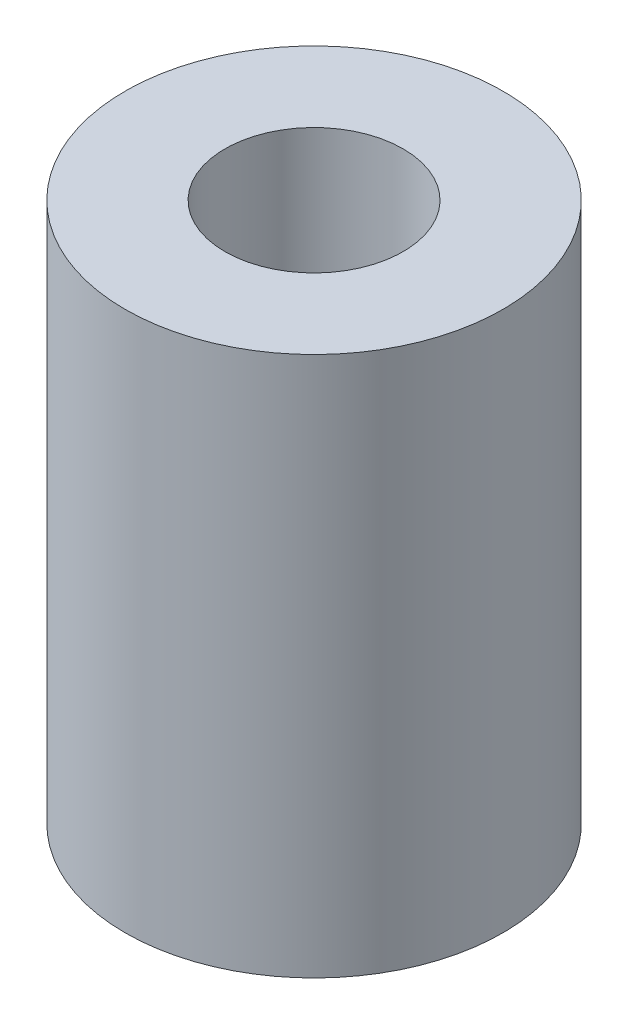
ISO-10303-21;
HEADER;
FILE_DESCRIPTION(('STEP AP214'),'2;1');
FILE_NAME('part.step','',(''),(''),'','','');
FILE_SCHEMA(('AUTOMOTIVE_DESIGN { 1 0 10303 214 1 1 1 1 }'));
ENDSEC;
DATA;
#1=APPLICATION_CONTEXT('core data for automotive mechanical design processes');
#2=APPLICATION_PROTOCOL_DEFINITION('international standard','automotive_design',2000,#1);
#3=PRODUCT_CONTEXT('',#1,'mechanical');
#4=PRODUCT('Part','Part','',(#3));
#5=PRODUCT_RELATED_PRODUCT_CATEGORY('part','',(#4));
#6=PRODUCT_DEFINITION_FORMATION('','',#4);
#7=PRODUCT_DEFINITION_CONTEXT('part definition',#1,'design');
#8=PRODUCT_DEFINITION('design','',#6,#7);
#9=PRODUCT_DEFINITION_SHAPE('','',#8);
#10=(LENGTH_UNIT() NAMED_UNIT(*) SI_UNIT(.MILLI.,.METRE.));
#11=(NAMED_UNIT(*) PLANE_ANGLE_UNIT() SI_UNIT($,.RADIAN.));
#12=(NAMED_UNIT(*) SI_UNIT($,.STERADIAN.) SOLID_ANGLE_UNIT());
#13=UNCERTAINTY_MEASURE_WITH_UNIT(LENGTH_MEASURE(1.E-05),#10,'distance_accuracy_value','');
#14=(GEOMETRIC_REPRESENTATION_CONTEXT(3) GLOBAL_UNCERTAINTY_ASSIGNED_CONTEXT((#13)) GLOBAL_UNIT_ASSIGNED_CONTEXT((#10,
#11,#12)) REPRESENTATION_CONTEXT('',''));
#15=CARTESIAN_POINT('',(0.,0.,0.));
#16=DIRECTION('',(0.,0.,1.));
#17=DIRECTION('',(1.,0.,0.));
#18=AXIS2_PLACEMENT_3D('',#15,#16,#17);
#19=CARTESIAN_POINT('',(0.,10.,0.));
#20=DIRECTION('',(0.,-1.,0.));
#21=DIRECTION('',(0.,0.,-1.));
#22=AXIS2_PLACEMENT_3D('',#19,#20,#21);
#23=CYLINDRICAL_SURFACE('',#22,3.5);
#24=CARTESIAN_POINT('',(0.,10.,0.));
#25=DIRECTION('',(0.,1.,0.));
#26=DIRECTION('',(0.,0.,1.));
#27=AXIS2_PLACEMENT_3D('',#24,#25,#26);
#28=CIRCLE('',#27,3.5);
#29=CARTESIAN_POINT('',(0.,10.,3.5));
#30=VERTEX_POINT('',#29);
#31=EDGE_CURVE('E10',#30,#30,#28,.T.);
#32=ORIENTED_EDGE('',*,*,#31,.F.);
#33=EDGE_LOOP('',(#32));
#34=FACE_BOUND('',#33,.T.);
#35=CARTESIAN_POINT('',(0.,0.,0.));
#36=DIRECTION('',(0.,1.,0.));
#37=DIRECTION('',(0.,0.,1.));
#38=AXIS2_PLACEMENT_3D('',#35,#36,#37);
#39=CIRCLE('',#38,3.5);
#40=CARTESIAN_POINT('',(0.,0.,3.5));
#41=VERTEX_POINT('',#40);
#42=EDGE_CURVE('E40',#41,#41,#39,.T.);
#43=ORIENTED_EDGE('',*,*,#42,.T.);
#44=EDGE_LOOP('',(#43));
#45=FACE_BOUND('',#44,.T.);
#46=ADVANCED_FACE('F37',(#34,#45),#23,.T.);
#47=CARTESIAN_POINT('',(0.,10.,0.));
#48=DIRECTION('',(0.,1.,0.));
#49=DIRECTION('',(0.,0.,1.));
#50=AXIS2_PLACEMENT_3D('',#47,#48,#49);
#51=PLANE('',#50);
#52=CARTESIAN_POINT('',(0.,10.,0.));
#53=DIRECTION('',(0.,1.,0.));
#54=DIRECTION('',(0.,0.,1.));
#55=AXIS2_PLACEMENT_3D('',#52,#53,#54);
#56=CIRCLE('',#55,1.65);
#57=CARTESIAN_POINT('',(0.,10.,1.65));
#58=VERTEX_POINT('',#57);
#59=EDGE_CURVE('E49',#58,#58,#56,.T.);
#60=ORIENTED_EDGE('',*,*,#59,.F.);
#61=EDGE_LOOP('',(#60));
#62=FACE_BOUND('',#61,.T.);
#63=ORIENTED_EDGE('',*,*,#31,.T.);
#64=EDGE_LOOP('',(#63));
#65=FACE_BOUND('',#64,.T.);
#66=ADVANCED_FACE('F64',(#62,#65),#51,.T.);
#67=CARTESIAN_POINT('',(0.,0.,0.));
#68=DIRECTION('',(0.,1.,0.));
#69=DIRECTION('',(0.,0.,1.));
#70=AXIS2_PLACEMENT_3D('',#67,#68,#69);
#71=PLANE('',#70);
#72=CARTESIAN_POINT('',(0.,0.,0.));
#73=DIRECTION('',(0.,1.,0.));
#74=DIRECTION('',(0.,0.,1.));
#75=AXIS2_PLACEMENT_3D('',#72,#73,#74);
#76=CIRCLE('',#75,1.65);
#77=CARTESIAN_POINT('',(0.,0.,1.65));
#78=VERTEX_POINT('',#77);
#79=EDGE_CURVE('E47',#78,#78,#76,.T.);
#80=ORIENTED_EDGE('',*,*,#79,.T.);
#81=EDGE_LOOP('',(#80));
#82=FACE_BOUND('',#81,.T.);
#83=ORIENTED_EDGE('',*,*,#42,.F.);
#84=EDGE_LOOP('',(#83));
#85=FACE_BOUND('',#84,.T.);
#86=ADVANCED_FACE('F55',(#82,#85),#71,.F.);
#87=CARTESIAN_POINT('',(0.,0.,0.));
#88=DIRECTION('',(0.,1.,0.));
#89=DIRECTION('',(0.,0.,1.));
#90=AXIS2_PLACEMENT_3D('',#87,#88,#89);
#91=CYLINDRICAL_SURFACE('',#90,1.65);
#92=ORIENTED_EDGE('',*,*,#79,.F.);
#93=EDGE_LOOP('',(#92));
#94=FACE_BOUND('',#93,.T.);
#95=ORIENTED_EDGE('',*,*,#59,.T.);
#96=EDGE_LOOP('',(#95));
#97=FACE_BOUND('',#96,.T.);
#98=ADVANCED_FACE('F58',(#94,#97),#91,.F.);
#99=CLOSED_SHELL('',(#46,#66,#86,#98));
#100=MANIFOLD_SOLID_BREP('B2',#99);
#101=ADVANCED_BREP_SHAPE_REPRESENTATION('',(#18,#100),#14);
#102=SHAPE_DEFINITION_REPRESENTATION(#9,#101);
ENDSEC;
END-ISO-10303-21;
